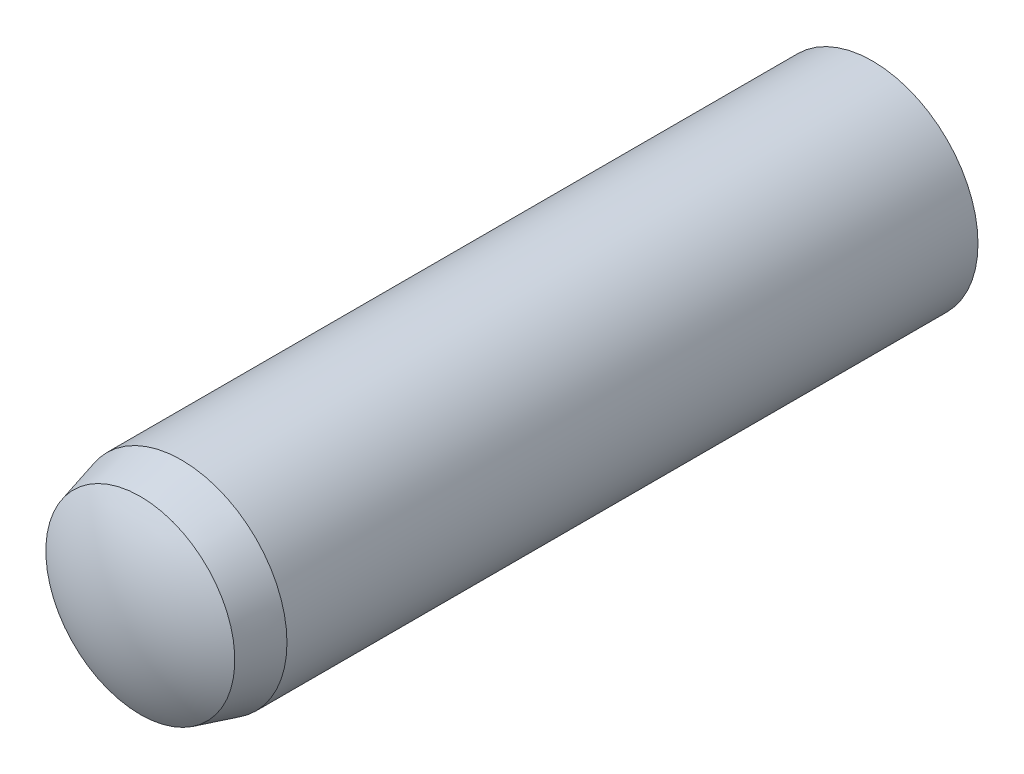
ISO-10303-21;
HEADER;
FILE_DESCRIPTION(('STEP AP214'),'2;1');
FILE_NAME('part.step','',(''),(''),'','','');
FILE_SCHEMA(('AUTOMOTIVE_DESIGN { 1 0 10303 214 1 1 1 1 }'));
ENDSEC;
DATA;
#1=APPLICATION_CONTEXT('core data for automotive mechanical design processes');
#2=APPLICATION_PROTOCOL_DEFINITION('international standard','automotive_design',2000,#1);
#3=PRODUCT_CONTEXT('',#1,'mechanical');
#4=PRODUCT('Part','Part','',(#3));
#5=PRODUCT_RELATED_PRODUCT_CATEGORY('part','',(#4));
#6=PRODUCT_DEFINITION_FORMATION('','',#4);
#7=PRODUCT_DEFINITION_CONTEXT('part definition',#1,'design');
#8=PRODUCT_DEFINITION('design','',#6,#7);
#9=PRODUCT_DEFINITION_SHAPE('','',#8);
#10=(LENGTH_UNIT() NAMED_UNIT(*) SI_UNIT(.MILLI.,.METRE.));
#11=(NAMED_UNIT(*) PLANE_ANGLE_UNIT() SI_UNIT($,.RADIAN.));
#12=(NAMED_UNIT(*) SI_UNIT($,.STERADIAN.) SOLID_ANGLE_UNIT());
#13=UNCERTAINTY_MEASURE_WITH_UNIT(LENGTH_MEASURE(1.E-05),#10,'distance_accuracy_value','');
#14=(GEOMETRIC_REPRESENTATION_CONTEXT(3) GLOBAL_UNCERTAINTY_ASSIGNED_CONTEXT((#13)) GLOBAL_UNIT_ASSIGNED_CONTEXT((#10,
#11,#12)) REPRESENTATION_CONTEXT('',''));
#15=CARTESIAN_POINT('',(0.,0.,0.));
#16=DIRECTION('',(0.,0.,1.));
#17=DIRECTION('',(1.,0.,0.));
#18=AXIS2_PLACEMENT_3D('',#15,#16,#17);
#19=CARTESIAN_POINT('',(0.,0.,-7.73333333333328));
#20=DIRECTION('',(0.,0.,1.));
#21=DIRECTION('',(0.,1.,0.));
#22=AXIS2_PLACEMENT_3D('',#19,#20,#21);
#23=SPHERICAL_SURFACE('',#22,7.26666666666672);
#24=CARTESIAN_POINT('',(0.,0.,-13.8));
#25=DIRECTION('',(0.,0.,1.));
#26=DIRECTION('',(0.,-1.,0.));
#27=AXIS2_PLACEMENT_3D('',#24,#25,#26);
#28=CIRCLE('',#27,3.99999999999999);
#29=CARTESIAN_POINT('',(0.,-3.99999999999999,-13.8));
#30=VERTEX_POINT('',#29);
#31=EDGE_CURVE('E10',#30,#30,#28,.T.);
#32=ORIENTED_EDGE('',*,*,#31,.F.);
#33=EDGE_LOOP('',(#32));
#34=FACE_BOUND('',#33,.T.);
#35=ADVANCED_FACE('F35',(#34),#23,.T.);
#36=CARTESIAN_POINT('',(0.,0.,15.));
#37=DIRECTION('',(0.,0.,1.));
#38=DIRECTION('',(0.,-1.,0.));
#39=AXIS2_PLACEMENT_3D('',#36,#37,#38);
#40=CYLINDRICAL_SURFACE('',#39,4.);
#41=CARTESIAN_POINT('',(0.,0.,12.4));
#42=DIRECTION('',(0.,0.,1.));
#43=DIRECTION('',(0.,-1.,0.));
#44=AXIS2_PLACEMENT_3D('',#41,#42,#43);
#45=CIRCLE('',#44,4.);
#46=CARTESIAN_POINT('',(0.,-4.,12.4));
#47=VERTEX_POINT('',#46);
#48=EDGE_CURVE('E41',#47,#47,#45,.T.);
#49=ORIENTED_EDGE('',*,*,#48,.F.);
#50=EDGE_LOOP('',(#49));
#51=FACE_BOUND('',#50,.T.);
#52=ORIENTED_EDGE('',*,*,#31,.T.);
#53=EDGE_LOOP('',(#52));
#54=FACE_BOUND('',#53,.T.);
#55=ADVANCED_FACE('F56',(#51,#54),#40,.T.);
#56=CARTESIAN_POINT('',(0.,0.,12.4));
#57=DIRECTION('',(0.,0.,-1.));
#58=DIRECTION('',(0.,1.,0.));
#59=AXIS2_PLACEMENT_3D('',#56,#57,#58);
#60=CONICAL_SURFACE('',#59,4.,0.261799387799151);
#61=CARTESIAN_POINT('',(0.,0.,13.96));
#62=DIRECTION('',(0.,0.,1.));
#63=DIRECTION('',(0.,-1.,0.));
#64=AXIS2_PLACEMENT_3D('',#61,#62,#63);
#65=CIRCLE('',#64,3.58199925980745);
#66=CARTESIAN_POINT('',(0.,-3.58199925980745,13.96));
#67=VERTEX_POINT('',#66);
#68=EDGE_CURVE('E45',#67,#67,#65,.T.);
#69=ORIENTED_EDGE('',*,*,#68,.F.);
#70=EDGE_LOOP('',(#69));
#71=FACE_BOUND('',#70,.T.);
#72=ORIENTED_EDGE('',*,*,#48,.T.);
#73=EDGE_LOOP('',(#72));
#74=FACE_BOUND('',#73,.T.);
#75=ADVANCED_FACE('F54',(#71,#74),#60,.T.);
#76=CARTESIAN_POINT('',(0.,0.,8.31138524170138));
#77=DIRECTION('',(0.,0.,1.));
#78=DIRECTION('',(0.,1.,0.));
#79=AXIS2_PLACEMENT_3D('',#76,#77,#78);
#80=SPHERICAL_SURFACE('',#79,6.68861475829861);
#81=ORIENTED_EDGE('',*,*,#68,.T.);
#82=EDGE_LOOP('',(#81));
#83=FACE_BOUND('',#82,.T.);
#84=ADVANCED_FACE('F52',(#83),#80,.T.);
#85=CLOSED_SHELL('',(#35,#55,#75,#84));
#86=MANIFOLD_SOLID_BREP('B2',#85);
#87=ADVANCED_BREP_SHAPE_REPRESENTATION('',(#18,#86),#14);
#88=SHAPE_DEFINITION_REPRESENTATION(#9,#87);
ENDSEC;
END-ISO-10303-21;
